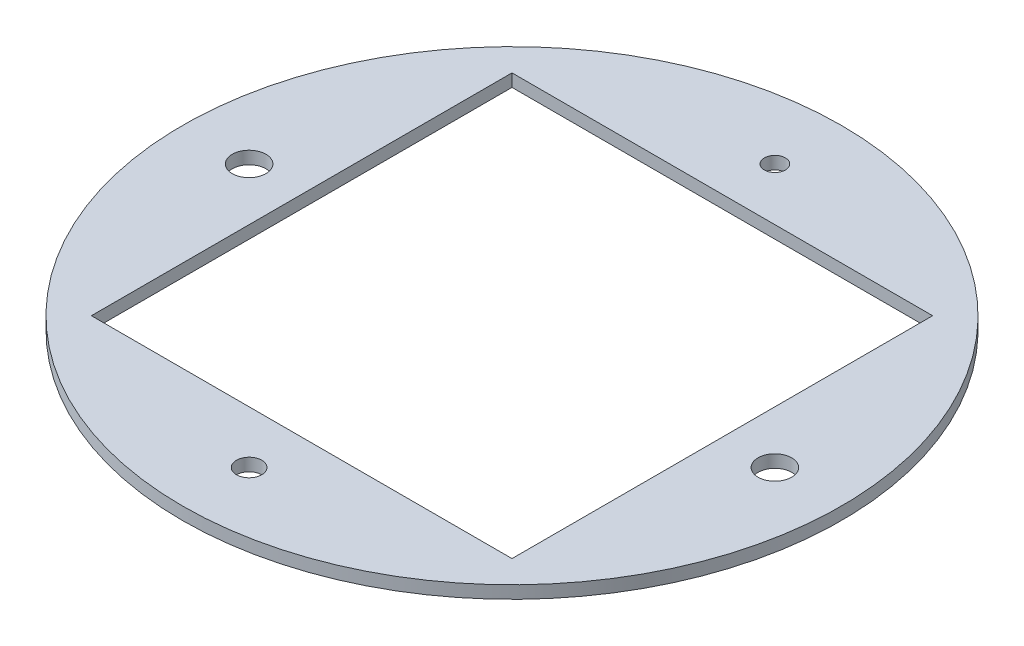
ISO-10303-21;
HEADER;
FILE_DESCRIPTION(('STEP AP214'),'2;1');
FILE_NAME('part.step','',(''),(''),'','','');
FILE_SCHEMA(('AUTOMOTIVE_DESIGN { 1 0 10303 214 1 1 1 1 }'));
ENDSEC;
DATA;
#1=APPLICATION_CONTEXT('core data for automotive mechanical design processes');
#2=APPLICATION_PROTOCOL_DEFINITION('international standard','automotive_design',2000,#1);
#3=PRODUCT_CONTEXT('',#1,'mechanical');
#4=PRODUCT('Part','Part','',(#3));
#5=PRODUCT_RELATED_PRODUCT_CATEGORY('part','',(#4));
#6=PRODUCT_DEFINITION_FORMATION('','',#4);
#7=PRODUCT_DEFINITION_CONTEXT('part definition',#1,'design');
#8=PRODUCT_DEFINITION('design','',#6,#7);
#9=PRODUCT_DEFINITION_SHAPE('','',#8);
#10=(LENGTH_UNIT() NAMED_UNIT(*) SI_UNIT(.MILLI.,.METRE.));
#11=(NAMED_UNIT(*) PLANE_ANGLE_UNIT() SI_UNIT($,.RADIAN.));
#12=(NAMED_UNIT(*) SI_UNIT($,.STERADIAN.) SOLID_ANGLE_UNIT());
#13=UNCERTAINTY_MEASURE_WITH_UNIT(LENGTH_MEASURE(1.E-05),#10,'distance_accuracy_value','');
#14=(GEOMETRIC_REPRESENTATION_CONTEXT(3) GLOBAL_UNCERTAINTY_ASSIGNED_CONTEXT((#13)) GLOBAL_UNIT_ASSIGNED_CONTEXT((#10,
#11,#12)) REPRESENTATION_CONTEXT('',''));
#15=CARTESIAN_POINT('',(0.,0.,0.));
#16=DIRECTION('',(0.,0.,1.));
#17=DIRECTION('',(1.,0.,0.));
#18=AXIS2_PLACEMENT_3D('',#15,#16,#17);
#19=CARTESIAN_POINT('',(0.,3.,0.));
#20=DIRECTION('',(0.,1.,0.));
#21=DIRECTION('',(0.,0.,1.));
#22=AXIS2_PLACEMENT_3D('',#19,#20,#21);
#23=PLANE('',#22);
#24=CARTESIAN_POINT('',(0.,3.,-62.5));
#25=DIRECTION('',(0.,1.,0.));
#26=DIRECTION('',(0.,0.,1.));
#27=AXIS2_PLACEMENT_3D('',#24,#25,#26);
#28=CIRCLE('',#27,2.5);
#29=CARTESIAN_POINT('',(0.,3.,-60.));
#30=VERTEX_POINT('',#29);
#31=EDGE_CURVE('E137',#30,#30,#28,.T.);
#32=ORIENTED_EDGE('',*,*,#31,.F.);
#33=EDGE_LOOP('',(#32));
#34=FACE_BOUND('',#33,.T.);
#35=CARTESIAN_POINT('',(-62.5,3.,0.));
#36=DIRECTION('',(0.,1.,0.));
#37=DIRECTION('',(0.,0.,1.));
#38=AXIS2_PLACEMENT_3D('',#35,#36,#37);
#39=CIRCLE('',#38,4.00000000000001);
#40=CARTESIAN_POINT('',(-62.5,3.,4.00000000000001));
#41=VERTEX_POINT('',#40);
#42=EDGE_CURVE('E153',#41,#41,#39,.T.);
#43=ORIENTED_EDGE('',*,*,#42,.F.);
#44=EDGE_LOOP('',(#43));
#45=FACE_BOUND('',#44,.T.);
#46=CARTESIAN_POINT('',(0.,3.,0.));
#47=DIRECTION('',(0.,1.,0.));
#48=DIRECTION('',(0.,0.,1.));
#49=AXIS2_PLACEMENT_3D('',#46,#47,#48);
#50=CIRCLE('',#49,78.35);
#51=CARTESIAN_POINT('',(0.,3.,78.35));
#52=VERTEX_POINT('',#51);
#53=EDGE_CURVE('E11',#52,#52,#50,.T.);
#54=ORIENTED_EDGE('',*,*,#53,.T.);
#55=EDGE_LOOP('',(#54));
#56=FACE_BOUND('',#55,.T.);
#57=CARTESIAN_POINT('',(0.,3.,62.5));
#58=DIRECTION('',(0.,1.,0.));
#59=DIRECTION('',(0.,0.,1.));
#60=AXIS2_PLACEMENT_3D('',#57,#58,#59);
#61=CIRCLE('',#60,3.);
#62=CARTESIAN_POINT('',(0.,3.,65.5));
#63=VERTEX_POINT('',#62);
#64=EDGE_CURVE('E145',#63,#63,#61,.T.);
#65=ORIENTED_EDGE('',*,*,#64,.F.);
#66=EDGE_LOOP('',(#65));
#67=FACE_BOUND('',#66,.T.);
#68=CARTESIAN_POINT('',(62.5,3.,0.));
#69=DIRECTION('',(0.,1.,0.));
#70=DIRECTION('',(0.,0.,1.));
#71=AXIS2_PLACEMENT_3D('',#68,#69,#70);
#72=CIRCLE('',#71,4.00000000000001);
#73=CARTESIAN_POINT('',(62.5,3.,4.00000000000001));
#74=VERTEX_POINT('',#73);
#75=EDGE_CURVE('E129',#74,#74,#72,.T.);
#76=ORIENTED_EDGE('',*,*,#75,.F.);
#77=EDGE_LOOP('',(#76));
#78=FACE_BOUND('',#77,.T.);
#79=DIRECTION('',(1.,0.,0.));
#80=VECTOR('',#79,1.);
#81=CARTESIAN_POINT('',(50.,3.,50.));
#82=LINE('',#81,#80);
#83=CARTESIAN_POINT('',(-50.,3.,50.));
#84=VERTEX_POINT('',#83);
#85=CARTESIAN_POINT('',(50.,3.,50.));
#86=VERTEX_POINT('',#85);
#87=EDGE_CURVE('E90',#84,#86,#82,.T.);
#88=ORIENTED_EDGE('',*,*,#87,.F.);
#89=DIRECTION('',(0.,0.,1.));
#90=VECTOR('',#89,1.);
#91=CARTESIAN_POINT('',(-50.,3.,50.));
#92=LINE('',#91,#90);
#93=CARTESIAN_POINT('',(-50.,3.,-50.));
#94=VERTEX_POINT('',#93);
#95=EDGE_CURVE('E81',#94,#84,#92,.T.);
#96=ORIENTED_EDGE('',*,*,#95,.F.);
#97=DIRECTION('',(-1.,0.,0.));
#98=VECTOR('',#97,1.);
#99=CARTESIAN_POINT('',(50.,3.,-50.));
#100=LINE('',#99,#98);
#101=CARTESIAN_POINT('',(50.,3.,-50.));
#102=VERTEX_POINT('',#101);
#103=EDGE_CURVE('E107',#102,#94,#100,.T.);
#104=ORIENTED_EDGE('',*,*,#103,.F.);
#105=DIRECTION('',(0.,0.,-1.));
#106=VECTOR('',#105,1.);
#107=CARTESIAN_POINT('',(50.,3.,50.));
#108=LINE('',#107,#106);
#109=EDGE_CURVE('E103',#86,#102,#108,.T.);
#110=ORIENTED_EDGE('',*,*,#109,.F.);
#111=EDGE_LOOP('',(#88,#96,#104,#110));
#112=FACE_BOUND('',#111,.T.);
#113=ADVANCED_FACE('F39',(#34,#45,#56,#67,#78,#112),#23,.T.);
#114=CARTESIAN_POINT('',(0.,0.,0.));
#115=DIRECTION('',(0.,1.,0.));
#116=DIRECTION('',(0.,0.,1.));
#117=AXIS2_PLACEMENT_3D('',#114,#115,#116);
#118=PLANE('',#117);
#119=CARTESIAN_POINT('',(62.5,0.,0.));
#120=DIRECTION('',(0.,1.,0.));
#121=DIRECTION('',(0.,0.,1.));
#122=AXIS2_PLACEMENT_3D('',#119,#120,#121);
#123=CIRCLE('',#122,4.00000000000001);
#124=CARTESIAN_POINT('',(62.5,0.,4.00000000000001));
#125=VERTEX_POINT('',#124);
#126=EDGE_CURVE('E99',#125,#125,#123,.T.);
#127=ORIENTED_EDGE('',*,*,#126,.T.);
#128=EDGE_LOOP('',(#127));
#129=FACE_BOUND('',#128,.T.);
#130=CARTESIAN_POINT('',(0.,0.,-62.5));
#131=DIRECTION('',(0.,1.,0.));
#132=DIRECTION('',(0.,0.,1.));
#133=AXIS2_PLACEMENT_3D('',#130,#131,#132);
#134=CIRCLE('',#133,2.5);
#135=CARTESIAN_POINT('',(0.,0.,-60.));
#136=VERTEX_POINT('',#135);
#137=EDGE_CURVE('E133',#136,#136,#134,.T.);
#138=ORIENTED_EDGE('',*,*,#137,.T.);
#139=EDGE_LOOP('',(#138));
#140=FACE_BOUND('',#139,.T.);
#141=CARTESIAN_POINT('',(0.,0.,62.5));
#142=DIRECTION('',(0.,1.,0.));
#143=DIRECTION('',(0.,0.,1.));
#144=AXIS2_PLACEMENT_3D('',#141,#142,#143);
#145=CIRCLE('',#144,3.);
#146=CARTESIAN_POINT('',(0.,0.,65.5));
#147=VERTEX_POINT('',#146);
#148=EDGE_CURVE('E141',#147,#147,#145,.T.);
#149=ORIENTED_EDGE('',*,*,#148,.T.);
#150=EDGE_LOOP('',(#149));
#151=FACE_BOUND('',#150,.T.);
#152=CARTESIAN_POINT('',(-62.5,0.,0.));
#153=DIRECTION('',(0.,1.,0.));
#154=DIRECTION('',(0.,0.,1.));
#155=AXIS2_PLACEMENT_3D('',#152,#153,#154);
#156=CIRCLE('',#155,4.00000000000001);
#157=CARTESIAN_POINT('',(-62.5,0.,4.00000000000001));
#158=VERTEX_POINT('',#157);
#159=EDGE_CURVE('E149',#158,#158,#156,.T.);
#160=ORIENTED_EDGE('',*,*,#159,.T.);
#161=EDGE_LOOP('',(#160));
#162=FACE_BOUND('',#161,.T.);
#163=CARTESIAN_POINT('',(0.,0.,0.));
#164=DIRECTION('',(0.,1.,0.));
#165=DIRECTION('',(0.,0.,1.));
#166=AXIS2_PLACEMENT_3D('',#163,#164,#165);
#167=CIRCLE('',#166,78.35);
#168=CARTESIAN_POINT('',(0.,0.,78.35));
#169=VERTEX_POINT('',#168);
#170=EDGE_CURVE('E43',#169,#169,#167,.T.);
#171=ORIENTED_EDGE('',*,*,#170,.F.);
#172=EDGE_LOOP('',(#171));
#173=FACE_BOUND('',#172,.T.);
#174=DIRECTION('',(0.,0.,1.));
#175=VECTOR('',#174,1.);
#176=CARTESIAN_POINT('',(-50.,0.,50.));
#177=LINE('',#176,#175);
#178=CARTESIAN_POINT('',(-50.,0.,-50.));
#179=VERTEX_POINT('',#178);
#180=CARTESIAN_POINT('',(-50.,0.,50.));
#181=VERTEX_POINT('',#180);
#182=EDGE_CURVE('E63',#179,#181,#177,.T.);
#183=ORIENTED_EDGE('',*,*,#182,.T.);
#184=DIRECTION('',(1.,0.,0.));
#185=VECTOR('',#184,1.);
#186=CARTESIAN_POINT('',(50.,0.,50.));
#187=LINE('',#186,#185);
#188=CARTESIAN_POINT('',(50.,0.,50.));
#189=VERTEX_POINT('',#188);
#190=EDGE_CURVE('E97',#181,#189,#187,.T.);
#191=ORIENTED_EDGE('',*,*,#190,.T.);
#192=DIRECTION('',(0.,0.,-1.));
#193=VECTOR('',#192,1.);
#194=CARTESIAN_POINT('',(50.,0.,50.));
#195=LINE('',#194,#193);
#196=CARTESIAN_POINT('',(50.,0.,-50.));
#197=VERTEX_POINT('',#196);
#198=EDGE_CURVE('E116',#189,#197,#195,.T.);
#199=ORIENTED_EDGE('',*,*,#198,.T.);
#200=DIRECTION('',(-1.,0.,0.));
#201=VECTOR('',#200,1.);
#202=CARTESIAN_POINT('',(50.,0.,-50.));
#203=LINE('',#202,#201);
#204=EDGE_CURVE('E91',#197,#179,#203,.T.);
#205=ORIENTED_EDGE('',*,*,#204,.T.);
#206=EDGE_LOOP('',(#183,#191,#199,#205));
#207=FACE_BOUND('',#206,.T.);
#208=ADVANCED_FACE('F161',(#129,#140,#151,#162,#173,#207),#118,.F.);
#209=CARTESIAN_POINT('',(0.,3.,0.));
#210=DIRECTION('',(0.,-1.,0.));
#211=DIRECTION('',(0.,0.,-1.));
#212=AXIS2_PLACEMENT_3D('',#209,#210,#211);
#213=CYLINDRICAL_SURFACE('',#212,78.35);
#214=ORIENTED_EDGE('',*,*,#53,.F.);
#215=EDGE_LOOP('',(#214));
#216=FACE_BOUND('',#215,.T.);
#217=ORIENTED_EDGE('',*,*,#170,.T.);
#218=EDGE_LOOP('',(#217));
#219=FACE_BOUND('',#218,.T.);
#220=ADVANCED_FACE('F41',(#216,#219),#213,.T.);
#221=CARTESIAN_POINT('',(-62.5,3.,0.));
#222=DIRECTION('',(0.,-1.,0.));
#223=DIRECTION('',(0.,0.,-1.));
#224=AXIS2_PLACEMENT_3D('',#221,#222,#223);
#225=CYLINDRICAL_SURFACE('',#224,4.00000000000001);
#226=ORIENTED_EDGE('',*,*,#42,.T.);
#227=EDGE_LOOP('',(#226));
#228=FACE_BOUND('',#227,.T.);
#229=ORIENTED_EDGE('',*,*,#159,.F.);
#230=EDGE_LOOP('',(#229));
#231=FACE_BOUND('',#230,.T.);
#232=ADVANCED_FACE('F164',(#228,#231),#225,.F.);
#233=CARTESIAN_POINT('',(0.,3.,62.5));
#234=DIRECTION('',(0.,-1.,0.));
#235=DIRECTION('',(0.,0.,-1.));
#236=AXIS2_PLACEMENT_3D('',#233,#234,#235);
#237=CYLINDRICAL_SURFACE('',#236,3.);
#238=ORIENTED_EDGE('',*,*,#64,.T.);
#239=EDGE_LOOP('',(#238));
#240=FACE_BOUND('',#239,.T.);
#241=ORIENTED_EDGE('',*,*,#148,.F.);
#242=EDGE_LOOP('',(#241));
#243=FACE_BOUND('',#242,.T.);
#244=ADVANCED_FACE('F166',(#240,#243),#237,.F.);
#245=CARTESIAN_POINT('',(0.,3.,-62.5));
#246=DIRECTION('',(0.,-1.,0.));
#247=DIRECTION('',(0.,0.,-1.));
#248=AXIS2_PLACEMENT_3D('',#245,#246,#247);
#249=CYLINDRICAL_SURFACE('',#248,2.5);
#250=ORIENTED_EDGE('',*,*,#31,.T.);
#251=EDGE_LOOP('',(#250));
#252=FACE_BOUND('',#251,.T.);
#253=ORIENTED_EDGE('',*,*,#137,.F.);
#254=EDGE_LOOP('',(#253));
#255=FACE_BOUND('',#254,.T.);
#256=ADVANCED_FACE('F173',(#252,#255),#249,.F.);
#257=CARTESIAN_POINT('',(62.5,3.,0.));
#258=DIRECTION('',(0.,-1.,0.));
#259=DIRECTION('',(0.,0.,-1.));
#260=AXIS2_PLACEMENT_3D('',#257,#258,#259);
#261=CYLINDRICAL_SURFACE('',#260,4.00000000000001);
#262=ORIENTED_EDGE('',*,*,#75,.T.);
#263=EDGE_LOOP('',(#262));
#264=FACE_BOUND('',#263,.T.);
#265=ORIENTED_EDGE('',*,*,#126,.F.);
#266=EDGE_LOOP('',(#265));
#267=FACE_BOUND('',#266,.T.);
#268=ADVANCED_FACE('F194',(#264,#267),#261,.F.);
#269=CARTESIAN_POINT('',(-50.,3.,50.));
#270=DIRECTION('',(1.,0.,0.));
#271=DIRECTION('',(0.,0.,-1.));
#272=AXIS2_PLACEMENT_3D('',#269,#270,#271);
#273=PLANE('',#272);
#274=ORIENTED_EDGE('',*,*,#182,.F.);
#275=DIRECTION('',(0.,-1.,0.));
#276=VECTOR('',#275,1.);
#277=CARTESIAN_POINT('',(-50.,3.,-50.));
#278=LINE('',#277,#276);
#279=EDGE_CURVE('E85',#94,#179,#278,.T.);
#280=ORIENTED_EDGE('',*,*,#279,.F.);
#281=ORIENTED_EDGE('',*,*,#95,.T.);
#282=DIRECTION('',(0.,-1.,0.));
#283=VECTOR('',#282,1.);
#284=CARTESIAN_POINT('',(-50.,3.,50.));
#285=LINE('',#284,#283);
#286=EDGE_CURVE('E84',#84,#181,#285,.T.);
#287=ORIENTED_EDGE('',*,*,#286,.T.);
#288=EDGE_LOOP('',(#274,#280,#281,#287));
#289=FACE_BOUND('',#288,.T.);
#290=ADVANCED_FACE('F83',(#289),#273,.T.);
#291=CARTESIAN_POINT('',(50.,3.,50.));
#292=DIRECTION('',(0.,0.,-1.));
#293=DIRECTION('',(-1.,0.,0.));
#294=AXIS2_PLACEMENT_3D('',#291,#292,#293);
#295=PLANE('',#294);
#296=ORIENTED_EDGE('',*,*,#190,.F.);
#297=ORIENTED_EDGE('',*,*,#286,.F.);
#298=ORIENTED_EDGE('',*,*,#87,.T.);
#299=DIRECTION('',(0.,-1.,0.));
#300=VECTOR('',#299,1.);
#301=CARTESIAN_POINT('',(50.,3.,50.));
#302=LINE('',#301,#300);
#303=EDGE_CURVE('E100',#86,#189,#302,.T.);
#304=ORIENTED_EDGE('',*,*,#303,.T.);
#305=EDGE_LOOP('',(#296,#297,#298,#304));
#306=FACE_BOUND('',#305,.T.);
#307=ADVANCED_FACE('F94',(#306),#295,.T.);
#308=CARTESIAN_POINT('',(50.,3.,50.));
#309=DIRECTION('',(-1.,0.,0.));
#310=DIRECTION('',(0.,0.,1.));
#311=AXIS2_PLACEMENT_3D('',#308,#309,#310);
#312=PLANE('',#311);
#313=ORIENTED_EDGE('',*,*,#198,.F.);
#314=ORIENTED_EDGE('',*,*,#303,.F.);
#315=ORIENTED_EDGE('',*,*,#109,.T.);
#316=DIRECTION('',(0.,-1.,0.));
#317=VECTOR('',#316,1.);
#318=CARTESIAN_POINT('',(50.,3.,-50.));
#319=LINE('',#318,#317);
#320=EDGE_CURVE('E55',#102,#197,#319,.T.);
#321=ORIENTED_EDGE('',*,*,#320,.T.);
#322=EDGE_LOOP('',(#313,#314,#315,#321));
#323=FACE_BOUND('',#322,.T.);
#324=ADVANCED_FACE('F215',(#323),#312,.T.);
#325=CARTESIAN_POINT('',(50.,3.,-50.));
#326=DIRECTION('',(0.,0.,1.));
#327=DIRECTION('',(1.,0.,0.));
#328=AXIS2_PLACEMENT_3D('',#325,#326,#327);
#329=PLANE('',#328);
#330=ORIENTED_EDGE('',*,*,#204,.F.);
#331=ORIENTED_EDGE('',*,*,#320,.F.);
#332=ORIENTED_EDGE('',*,*,#103,.T.);
#333=ORIENTED_EDGE('',*,*,#279,.T.);
#334=EDGE_LOOP('',(#330,#331,#332,#333));
#335=FACE_BOUND('',#334,.T.);
#336=ADVANCED_FACE('F218',(#335),#329,.T.);
#337=CLOSED_SHELL('',(#113,#208,#220,#232,#244,#256,#268,#290,#307,#324,#336));
#338=MANIFOLD_SOLID_BREP('B2',#337);
#339=ADVANCED_BREP_SHAPE_REPRESENTATION('',(#18,#338),#14);
#340=SHAPE_DEFINITION_REPRESENTATION(#9,#339);
ENDSEC;
END-ISO-10303-21;
